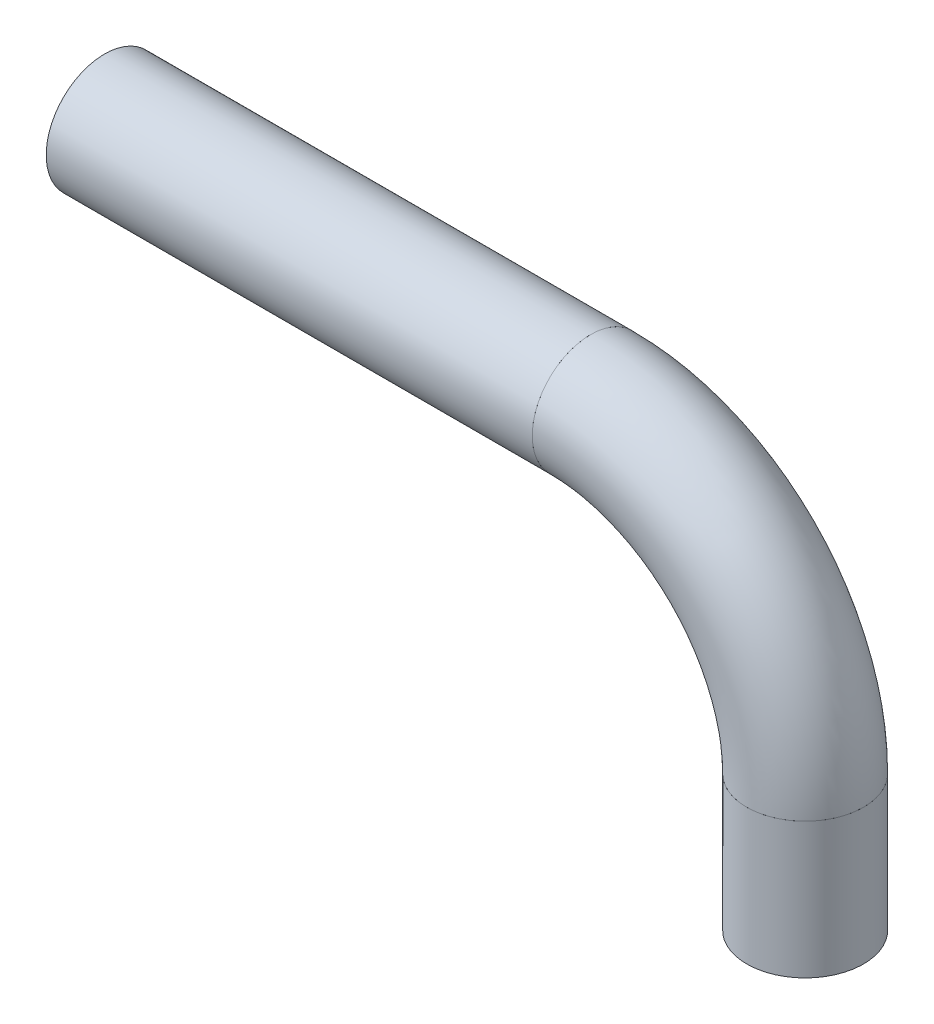
ISO-10303-21;
HEADER;
FILE_DESCRIPTION(('STEP AP214'),'2;1');
FILE_NAME('part.step','',(''),(''),'','','');
FILE_SCHEMA(('AUTOMOTIVE_DESIGN { 1 0 10303 214 1 1 1 1 }'));
ENDSEC;
DATA;
#1=APPLICATION_CONTEXT('core data for automotive mechanical design processes');
#2=APPLICATION_PROTOCOL_DEFINITION('international standard','automotive_design',2000,#1);
#3=PRODUCT_CONTEXT('',#1,'mechanical');
#4=PRODUCT('Part','Part','',(#3));
#5=PRODUCT_RELATED_PRODUCT_CATEGORY('part','',(#4));
#6=PRODUCT_DEFINITION_FORMATION('','',#4);
#7=PRODUCT_DEFINITION_CONTEXT('part definition',#1,'design');
#8=PRODUCT_DEFINITION('design','',#6,#7);
#9=PRODUCT_DEFINITION_SHAPE('','',#8);
#10=(LENGTH_UNIT() NAMED_UNIT(*) SI_UNIT(.MILLI.,.METRE.));
#11=(NAMED_UNIT(*) PLANE_ANGLE_UNIT() SI_UNIT($,.RADIAN.));
#12=(NAMED_UNIT(*) SI_UNIT($,.STERADIAN.) SOLID_ANGLE_UNIT());
#13=UNCERTAINTY_MEASURE_WITH_UNIT(LENGTH_MEASURE(1.E-05),#10,'distance_accuracy_value','');
#14=(GEOMETRIC_REPRESENTATION_CONTEXT(3) GLOBAL_UNCERTAINTY_ASSIGNED_CONTEXT((#13)) GLOBAL_UNIT_ASSIGNED_CONTEXT((#10,
#11,#12)) REPRESENTATION_CONTEXT('',''));
#15=CARTESIAN_POINT('',(0.,0.,0.));
#16=DIRECTION('',(0.,0.,1.));
#17=DIRECTION('',(1.,0.,0.));
#18=AXIS2_PLACEMENT_3D('',#15,#16,#17);
#19=CARTESIAN_POINT('',(634.399999999998,0.,0.));
#20=DIRECTION('',(-1.,0.,0.));
#21=DIRECTION('',(0.,0.,1.));
#22=AXIS2_PLACEMENT_3D('',#19,#20,#21);
#23=CYLINDRICAL_SURFACE('',#22,63.5);
#24=CARTESIAN_POINT('',(0.,0.,0.));
#25=DIRECTION('',(1.,0.,0.));
#26=DIRECTION('',(0.,0.,-1.));
#27=AXIS2_PLACEMENT_3D('',#24,#25,#26);
#28=CIRCLE('',#27,63.5);
#29=CARTESIAN_POINT('',(0.,0.,-63.5));
#30=VERTEX_POINT('',#29);
#31=EDGE_CURVE('E58',#30,#30,#28,.T.);
#32=ORIENTED_EDGE('',*,*,#31,.F.);
#33=EDGE_LOOP('',(#32));
#34=FACE_BOUND('',#33,.T.);
#35=CARTESIAN_POINT('',(634.399999999998,0.,0.));
#36=DIRECTION('',(1.,0.,0.));
#37=DIRECTION('',(0.,0.,-1.));
#38=AXIS2_PLACEMENT_3D('',#35,#36,#37);
#39=CIRCLE('',#38,63.5);
#40=CARTESIAN_POINT('',(634.399999999998,0.,-63.5));
#41=VERTEX_POINT('',#40);
#42=EDGE_CURVE('E54',#41,#41,#39,.T.);
#43=ORIENTED_EDGE('',*,*,#42,.T.);
#44=EDGE_LOOP('',(#43));
#45=FACE_BOUND('',#44,.T.);
#46=ADVANCED_FACE('F50',(#34,#45),#23,.F.);
#47=CARTESIAN_POINT('',(634.399999999998,0.,0.));
#48=DIRECTION('',(-1.,0.,0.));
#49=DIRECTION('',(0.,0.,1.));
#50=AXIS2_PLACEMENT_3D('',#47,#48,#49);
#51=CYLINDRICAL_SURFACE('',#50,76.2);
#52=CARTESIAN_POINT('',(0.,0.,0.));
#53=DIRECTION('',(1.,0.,0.));
#54=DIRECTION('',(0.,0.,-1.));
#55=AXIS2_PLACEMENT_3D('',#52,#53,#54);
#56=CIRCLE('',#55,76.2);
#57=CARTESIAN_POINT('',(0.,0.,-76.2));
#58=VERTEX_POINT('',#57);
#59=EDGE_CURVE('E62',#58,#58,#56,.T.);
#60=ORIENTED_EDGE('',*,*,#59,.T.);
#61=EDGE_LOOP('',(#60));
#62=FACE_BOUND('',#61,.T.);
#63=CARTESIAN_POINT('',(634.399999999998,0.,0.));
#64=DIRECTION('',(1.,0.,0.));
#65=DIRECTION('',(0.,0.,-1.));
#66=AXIS2_PLACEMENT_3D('',#63,#64,#65);
#67=CIRCLE('',#66,76.2);
#68=CARTESIAN_POINT('',(634.399999999998,0.,-76.2));
#69=VERTEX_POINT('',#68);
#70=EDGE_CURVE('E12',#69,#69,#67,.T.);
#71=ORIENTED_EDGE('',*,*,#70,.F.);
#72=EDGE_LOOP('',(#71));
#73=FACE_BOUND('',#72,.T.);
#74=ADVANCED_FACE('F77',(#62,#73),#51,.T.);
#75=CARTESIAN_POINT('',(0.,0.,0.));
#76=DIRECTION('',(1.,0.,0.));
#77=DIRECTION('',(0.,0.,-1.));
#78=AXIS2_PLACEMENT_3D('',#75,#76,#77);
#79=PLANE('',#78);
#80=ORIENTED_EDGE('',*,*,#31,.T.);
#81=EDGE_LOOP('',(#80));
#82=FACE_BOUND('',#81,.T.);
#83=ORIENTED_EDGE('',*,*,#59,.F.);
#84=EDGE_LOOP('',(#83));
#85=FACE_BOUND('',#84,.T.);
#86=ADVANCED_FACE('F73',(#82,#85),#79,.F.);
#87=CARTESIAN_POINT('',(634.399999999998,0.,0.));
#88=DIRECTION('',(1.,0.,0.));
#89=DIRECTION('',(0.,0.,-1.));
#90=AXIS2_PLACEMENT_3D('',#87,#88,#89);
#91=PLANE('',#90);
#92=ORIENTED_EDGE('',*,*,#42,.F.);
#93=EDGE_LOOP('',(#92));
#94=FACE_BOUND('',#93,.T.);
#95=ORIENTED_EDGE('',*,*,#70,.T.);
#96=EDGE_LOOP('',(#95));
#97=FACE_BOUND('',#96,.T.);
#98=ADVANCED_FACE('F52',(#94,#97),#91,.T.);
#99=CLOSED_SHELL('',(#46,#74,#86,#98));
#100=MANIFOLD_SOLID_BREP('B2',#99);
#101=CARTESIAN_POINT('',(634.4,-280.,0.));
#102=DIRECTION('',(0.,0.,1.));
#103=DIRECTION('',(1.,0.,0.));
#104=AXIS2_PLACEMENT_3D('',#101,#102,#103);
#105=TOROIDAL_SURFACE('',#104,280.,63.5);
#106=CARTESIAN_POINT('',(914.4,-280.000000000004,0.));
#107=DIRECTION('',(0.,-1.,0.));
#108=DIRECTION('',(1.,0.,0.));
#109=AXIS2_PLACEMENT_3D('',#106,#107,#108);
#110=CIRCLE('',#109,63.5);
#111=CARTESIAN_POINT('',(977.9,-280.000000000005,0.));
#112=VERTEX_POINT('',#111);
#113=EDGE_CURVE('E153',#112,#112,#110,.F.);
#114=CARTESIAN_POINT('',(634.4,0.,0.));
#115=DIRECTION('',(-1.,0.,0.));
#116=DIRECTION('',(0.,0.,1.));
#117=AXIS2_PLACEMENT_3D('',#114,#115,#116);
#118=CIRCLE('',#117,63.5);
#119=CARTESIAN_POINT('',(634.4,63.4999999999999,0.));
#120=VERTEX_POINT('',#119);
#121=EDGE_CURVE('E49',#120,#120,#118,.F.);
#122=CARTESIAN_POINT('',(634.4,-280.,0.));
#123=DIRECTION('',(0.,0.,1.));
#124=DIRECTION('',(1.,0.,0.));
#125=AXIS2_PLACEMENT_3D('',#122,#123,#124);
#126=CIRCLE('',#125,343.5);
#127=EDGE_CURVE('',#112,#120,#126,.T.);
#128=ORIENTED_EDGE('',*,*,#113,.F.);
#129=ORIENTED_EDGE('',*,*,#121,.F.);
#130=ORIENTED_EDGE('',*,*,#127,.T.);
#131=ORIENTED_EDGE('',*,*,#127,.F.);
#132=EDGE_LOOP('',(#128,#130,#129,#131));
#133=FACE_BOUND('',#132,.T.);
#134=ADVANCED_FACE('F142',(#133),#105,.F.);
#135=CARTESIAN_POINT('',(634.4,-280.,0.));
#136=DIRECTION('',(0.,0.,1.));
#137=DIRECTION('',(1.,0.,0.));
#138=AXIS2_PLACEMENT_3D('',#135,#136,#137);
#139=TOROIDAL_SURFACE('',#138,280.,76.2);
#140=CARTESIAN_POINT('',(914.4,-280.000000000004,0.));
#141=DIRECTION('',(0.,-1.,0.));
#142=DIRECTION('',(1.,0.,0.));
#143=AXIS2_PLACEMENT_3D('',#140,#141,#142);
#144=CIRCLE('',#143,76.2);
#145=CARTESIAN_POINT('',(990.6,-280.000000000005,0.));
#146=VERTEX_POINT('',#145);
#147=EDGE_CURVE('E158',#146,#146,#144,.T.);
#148=CARTESIAN_POINT('',(634.4,0.,0.));
#149=DIRECTION('',(-1.,0.,0.));
#150=DIRECTION('',(0.,0.,1.));
#151=AXIS2_PLACEMENT_3D('',#148,#149,#150);
#152=CIRCLE('',#151,76.2);
#153=CARTESIAN_POINT('',(634.4,76.1999999999999,0.));
#154=VERTEX_POINT('',#153);
#155=EDGE_CURVE('E149',#154,#154,#152,.T.);
#156=CARTESIAN_POINT('',(634.4,-280.,0.));
#157=DIRECTION('',(0.,0.,1.));
#158=DIRECTION('',(1.,0.,0.));
#159=AXIS2_PLACEMENT_3D('',#156,#157,#158);
#160=CIRCLE('',#159,356.2);
#161=EDGE_CURVE('',#146,#154,#160,.T.);
#162=ORIENTED_EDGE('',*,*,#147,.F.);
#163=ORIENTED_EDGE('',*,*,#155,.F.);
#164=ORIENTED_EDGE('',*,*,#161,.T.);
#165=ORIENTED_EDGE('',*,*,#161,.F.);
#166=EDGE_LOOP('',(#162,#164,#163,#165));
#167=FACE_BOUND('',#166,.T.);
#168=ADVANCED_FACE('F166',(#167),#139,.T.);
#169=CARTESIAN_POINT('',(914.4,-280.000000000002,0.));
#170=DIRECTION('',(0.,-1.,0.));
#171=DIRECTION('',(1.,0.,0.));
#172=AXIS2_PLACEMENT_3D('',#169,#170,#171);
#173=PLANE('',#172);
#174=ORIENTED_EDGE('',*,*,#147,.T.);
#175=EDGE_LOOP('',(#174));
#176=FACE_BOUND('',#175,.T.);
#177=ORIENTED_EDGE('',*,*,#113,.T.);
#178=EDGE_LOOP('',(#177));
#179=FACE_BOUND('',#178,.T.);
#180=ADVANCED_FACE('F163',(#176,#179),#173,.T.);
#181=CARTESIAN_POINT('',(634.399999999998,0.,0.));
#182=DIRECTION('',(-1.,0.,0.));
#183=DIRECTION('',(0.,0.,1.));
#184=AXIS2_PLACEMENT_3D('',#181,#182,#183);
#185=PLANE('',#184);
#186=ORIENTED_EDGE('',*,*,#155,.T.);
#187=EDGE_LOOP('',(#186));
#188=FACE_BOUND('',#187,.T.);
#189=ORIENTED_EDGE('',*,*,#121,.T.);
#190=EDGE_LOOP('',(#189));
#191=FACE_BOUND('',#190,.T.);
#192=ADVANCED_FACE('F144',(#188,#191),#185,.T.);
#193=CLOSED_SHELL('',(#134,#168,#180,#192));
#194=MANIFOLD_SOLID_BREP('B7',#193);
#195=CARTESIAN_POINT('',(914.4,-457.2,0.));
#196=DIRECTION('',(0.,1.,0.));
#197=DIRECTION('',(0.,0.,1.));
#198=AXIS2_PLACEMENT_3D('',#195,#196,#197);
#199=CYLINDRICAL_SURFACE('',#198,63.5);
#200=CARTESIAN_POINT('',(914.4,-457.2,0.));
#201=DIRECTION('',(0.,-1.,0.));
#202=DIRECTION('',(0.,0.,-1.));
#203=AXIS2_PLACEMENT_3D('',#200,#201,#202);
#204=CIRCLE('',#203,63.5);
#205=CARTESIAN_POINT('',(914.4,-457.2,-63.5));
#206=VERTEX_POINT('',#205);
#207=EDGE_CURVE('E243',#206,#206,#204,.T.);
#208=ORIENTED_EDGE('',*,*,#207,.T.);
#209=EDGE_LOOP('',(#208));
#210=FACE_BOUND('',#209,.T.);
#211=CARTESIAN_POINT('',(914.4,-280.000000000002,0.));
#212=DIRECTION('',(0.,1.,0.));
#213=DIRECTION('',(-1.,0.,0.));
#214=AXIS2_PLACEMENT_3D('',#211,#212,#213);
#215=CIRCLE('',#214,63.5);
#216=CARTESIAN_POINT('',(850.9,-280.000000000001,0.));
#217=VERTEX_POINT('',#216);
#218=EDGE_CURVE('E233',#217,#217,#215,.T.);
#219=ORIENTED_EDGE('',*,*,#218,.T.);
#220=EDGE_LOOP('',(#219));
#221=FACE_BOUND('',#220,.T.);
#222=ADVANCED_FACE('F229',(#210,#221),#199,.F.);
#223=CARTESIAN_POINT('',(914.4,-457.2,0.));
#224=DIRECTION('',(0.,1.,0.));
#225=DIRECTION('',(0.,0.,1.));
#226=AXIS2_PLACEMENT_3D('',#223,#224,#225);
#227=CYLINDRICAL_SURFACE('',#226,76.2);
#228=CARTESIAN_POINT('',(914.4,-457.2,0.));
#229=DIRECTION('',(0.,-1.,0.));
#230=DIRECTION('',(0.,0.,-1.));
#231=AXIS2_PLACEMENT_3D('',#228,#229,#230);
#232=CIRCLE('',#231,76.2);
#233=CARTESIAN_POINT('',(914.4,-457.2,-76.2));
#234=VERTEX_POINT('',#233);
#235=EDGE_CURVE('E237',#234,#234,#232,.T.);
#236=ORIENTED_EDGE('',*,*,#235,.F.);
#237=EDGE_LOOP('',(#236));
#238=FACE_BOUND('',#237,.T.);
#239=CARTESIAN_POINT('',(914.4,-280.000000000002,0.));
#240=DIRECTION('',(0.,1.,0.));
#241=DIRECTION('',(-1.,0.,0.));
#242=AXIS2_PLACEMENT_3D('',#239,#240,#241);
#243=CIRCLE('',#242,76.2);
#244=CARTESIAN_POINT('',(838.2,-280.000000000001,0.));
#245=VERTEX_POINT('',#244);
#246=EDGE_CURVE('E141',#245,#245,#243,.T.);
#247=ORIENTED_EDGE('',*,*,#246,.F.);
#248=EDGE_LOOP('',(#247));
#249=FACE_BOUND('',#248,.T.);
#250=ADVANCED_FACE('F256',(#238,#249),#227,.T.);
#251=CARTESIAN_POINT('',(914.4,-457.2,0.));
#252=DIRECTION('',(0.,-1.,0.));
#253=DIRECTION('',(0.,0.,-1.));
#254=AXIS2_PLACEMENT_3D('',#251,#252,#253);
#255=PLANE('',#254);
#256=ORIENTED_EDGE('',*,*,#207,.F.);
#257=EDGE_LOOP('',(#256));
#258=FACE_BOUND('',#257,.T.);
#259=ORIENTED_EDGE('',*,*,#235,.T.);
#260=EDGE_LOOP('',(#259));
#261=FACE_BOUND('',#260,.T.);
#262=ADVANCED_FACE('F252',(#258,#261),#255,.T.);
#263=CARTESIAN_POINT('',(914.4,-280.000000000002,0.));
#264=DIRECTION('',(0.,1.,0.));
#265=DIRECTION('',(-1.,0.,0.));
#266=AXIS2_PLACEMENT_3D('',#263,#264,#265);
#267=PLANE('',#266);
#268=ORIENTED_EDGE('',*,*,#218,.F.);
#269=EDGE_LOOP('',(#268));
#270=FACE_BOUND('',#269,.T.);
#271=ORIENTED_EDGE('',*,*,#246,.T.);
#272=EDGE_LOOP('',(#271));
#273=FACE_BOUND('',#272,.T.);
#274=ADVANCED_FACE('F231',(#270,#273),#267,.T.);
#275=CLOSED_SHELL('',(#222,#250,#262,#274));
#276=MANIFOLD_SOLID_BREP('B44',#275);
#277=ADVANCED_BREP_SHAPE_REPRESENTATION('',(#18,#100,#194,#276),#14);
#278=SHAPE_DEFINITION_REPRESENTATION(#9,#277);
ENDSEC;
END-ISO-10303-21;
